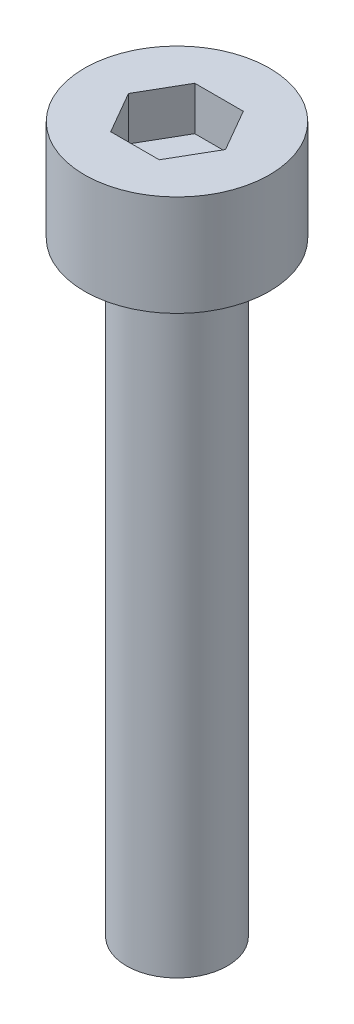
ISO-10303-21;
HEADER;
FILE_DESCRIPTION(('STEP AP214'),'2;1');
FILE_NAME('part.step','',(''),(''),'','','');
FILE_SCHEMA(('AUTOMOTIVE_DESIGN { 1 0 10303 214 1 1 1 1 }'));
ENDSEC;
DATA;
#1=APPLICATION_CONTEXT('core data for automotive mechanical design processes');
#2=APPLICATION_PROTOCOL_DEFINITION('international standard','automotive_design',2000,#1);
#3=PRODUCT_CONTEXT('',#1,'mechanical');
#4=PRODUCT('Part','Part','',(#3));
#5=PRODUCT_RELATED_PRODUCT_CATEGORY('part','',(#4));
#6=PRODUCT_DEFINITION_FORMATION('','',#4);
#7=PRODUCT_DEFINITION_CONTEXT('part definition',#1,'design');
#8=PRODUCT_DEFINITION('design','',#6,#7);
#9=PRODUCT_DEFINITION_SHAPE('','',#8);
#10=(LENGTH_UNIT() NAMED_UNIT(*) SI_UNIT(.MILLI.,.METRE.));
#11=(NAMED_UNIT(*) PLANE_ANGLE_UNIT() SI_UNIT($,.RADIAN.));
#12=(NAMED_UNIT(*) SI_UNIT($,.STERADIAN.) SOLID_ANGLE_UNIT());
#13=UNCERTAINTY_MEASURE_WITH_UNIT(LENGTH_MEASURE(1.E-05),#10,'distance_accuracy_value','');
#14=(GEOMETRIC_REPRESENTATION_CONTEXT(3) GLOBAL_UNCERTAINTY_ASSIGNED_CONTEXT((#13)) GLOBAL_UNIT_ASSIGNED_CONTEXT((#10,
#11,#12)) REPRESENTATION_CONTEXT('',''));
#15=CARTESIAN_POINT('',(0.,0.,0.));
#16=DIRECTION('',(0.,0.,1.));
#17=DIRECTION('',(1.,0.,0.));
#18=AXIS2_PLACEMENT_3D('',#15,#16,#17);
#19=CARTESIAN_POINT('',(0.,3.,0.));
#20=DIRECTION('',(0.,-1.,0.));
#21=DIRECTION('',(0.,0.,-1.));
#22=AXIS2_PLACEMENT_3D('',#19,#20,#21);
#23=CYLINDRICAL_SURFACE('',#22,2.75);
#24=CARTESIAN_POINT('',(0.,3.,0.));
#25=DIRECTION('',(0.,1.,0.));
#26=DIRECTION('',(0.,0.,1.));
#27=AXIS2_PLACEMENT_3D('',#24,#25,#26);
#28=CIRCLE('',#27,2.75);
#29=CARTESIAN_POINT('',(0.,3.,2.75));
#30=VERTEX_POINT('',#29);
#31=EDGE_CURVE('E11',#30,#30,#28,.T.);
#32=ORIENTED_EDGE('',*,*,#31,.F.);
#33=EDGE_LOOP('',(#32));
#34=FACE_BOUND('',#33,.T.);
#35=CARTESIAN_POINT('',(0.,0.,0.));
#36=DIRECTION('',(0.,1.,0.));
#37=DIRECTION('',(0.,0.,1.));
#38=AXIS2_PLACEMENT_3D('',#35,#36,#37);
#39=CIRCLE('',#38,2.75);
#40=CARTESIAN_POINT('',(0.,0.,2.75));
#41=VERTEX_POINT('',#40);
#42=EDGE_CURVE('E42',#41,#41,#39,.T.);
#43=ORIENTED_EDGE('',*,*,#42,.T.);
#44=EDGE_LOOP('',(#43));
#45=FACE_BOUND('',#44,.T.);
#46=ADVANCED_FACE('F39',(#34,#45),#23,.T.);
#47=CARTESIAN_POINT('',(0.,3.,0.));
#48=DIRECTION('',(0.,1.,0.));
#49=DIRECTION('',(0.,0.,1.));
#50=AXIS2_PLACEMENT_3D('',#47,#48,#49);
#51=PLANE('',#50);
#52=DIRECTION('',(0.5,0.,-0.866025403784439));
#53=VECTOR('',#52,1.);
#54=CARTESIAN_POINT('',(0.721687836487033,3.,1.25));
#55=LINE('',#54,#53);
#56=CARTESIAN_POINT('',(0.721687836487033,3.,1.25));
#57=VERTEX_POINT('',#56);
#58=CARTESIAN_POINT('',(1.44337567297406,3.,0.));
#59=VERTEX_POINT('',#58);
#60=EDGE_CURVE('E53',#57,#59,#55,.T.);
#61=ORIENTED_EDGE('',*,*,#60,.F.);
#62=DIRECTION('',(1.,0.,0.));
#63=VECTOR('',#62,1.);
#64=CARTESIAN_POINT('',(-0.721687836487031,3.,1.25));
#65=LINE('',#64,#63);
#66=CARTESIAN_POINT('',(-0.721687836487031,3.,1.25));
#67=VERTEX_POINT('',#66);
#68=EDGE_CURVE('E136',#67,#57,#65,.T.);
#69=ORIENTED_EDGE('',*,*,#68,.F.);
#70=DIRECTION('',(0.5,0.,0.866025403784438));
#71=VECTOR('',#70,1.);
#72=CARTESIAN_POINT('',(-1.44337567297406,3.,0.));
#73=LINE('',#72,#71);
#74=CARTESIAN_POINT('',(-1.44337567297406,3.,0.));
#75=VERTEX_POINT('',#74);
#76=EDGE_CURVE('E134',#75,#67,#73,.T.);
#77=ORIENTED_EDGE('',*,*,#76,.F.);
#78=DIRECTION('',(-0.5,0.,0.866025403784439));
#79=VECTOR('',#78,1.);
#80=CARTESIAN_POINT('',(-0.721687836487032,3.,-1.25));
#81=LINE('',#80,#79);
#82=CARTESIAN_POINT('',(-0.721687836487032,3.,-1.25));
#83=VERTEX_POINT('',#82);
#84=EDGE_CURVE('E101',#83,#75,#81,.T.);
#85=ORIENTED_EDGE('',*,*,#84,.F.);
#86=DIRECTION('',(-1.,0.,0.));
#87=VECTOR('',#86,1.);
#88=CARTESIAN_POINT('',(0.721687836487032,3.,-1.25));
#89=LINE('',#88,#87);
#90=CARTESIAN_POINT('',(0.721687836487032,3.,-1.25));
#91=VERTEX_POINT('',#90);
#92=EDGE_CURVE('E130',#91,#83,#89,.T.);
#93=ORIENTED_EDGE('',*,*,#92,.F.);
#94=DIRECTION('',(-0.5,0.,-0.866025403784439));
#95=VECTOR('',#94,1.);
#96=CARTESIAN_POINT('',(1.44337567297406,3.,0.));
#97=LINE('',#96,#95);
#98=EDGE_CURVE('E127',#59,#91,#97,.T.);
#99=ORIENTED_EDGE('',*,*,#98,.F.);
#100=EDGE_LOOP('',(#61,#69,#77,#85,#93,#99));
#101=FACE_BOUND('',#100,.T.);
#102=ORIENTED_EDGE('',*,*,#31,.T.);
#103=EDGE_LOOP('',(#102));
#104=FACE_BOUND('',#103,.T.);
#105=ADVANCED_FACE('F167',(#101,#104),#51,.T.);
#106=CARTESIAN_POINT('',(0.,0.,0.));
#107=DIRECTION('',(0.,1.,0.));
#108=DIRECTION('',(0.,0.,1.));
#109=AXIS2_PLACEMENT_3D('',#106,#107,#108);
#110=PLANE('',#109);
#111=CARTESIAN_POINT('',(0.,0.,0.));
#112=DIRECTION('',(0.,1.,0.));
#113=DIRECTION('',(0.,0.,1.));
#114=AXIS2_PLACEMENT_3D('',#111,#112,#113);
#115=CIRCLE('',#114,1.5);
#116=CARTESIAN_POINT('',(0.,0.,1.5));
#117=VERTEX_POINT('',#116);
#118=EDGE_CURVE('E140',#117,#117,#115,.T.);
#119=ORIENTED_EDGE('',*,*,#118,.T.);
#120=EDGE_LOOP('',(#119));
#121=FACE_BOUND('',#120,.T.);
#122=ORIENTED_EDGE('',*,*,#42,.F.);
#123=EDGE_LOOP('',(#122));
#124=FACE_BOUND('',#123,.T.);
#125=ADVANCED_FACE('F152',(#121,#124),#110,.F.);
#126=CARTESIAN_POINT('',(0.,-18.,0.));
#127=DIRECTION('',(0.,1.,0.));
#128=DIRECTION('',(0.,0.,1.));
#129=AXIS2_PLACEMENT_3D('',#126,#127,#128);
#130=CYLINDRICAL_SURFACE('',#129,1.5);
#131=CARTESIAN_POINT('',(0.,-18.,0.));
#132=DIRECTION('',(0.,1.,0.));
#133=DIRECTION('',(0.,0.,1.));
#134=AXIS2_PLACEMENT_3D('',#131,#132,#133);
#135=CIRCLE('',#134,1.5);
#136=CARTESIAN_POINT('',(0.,-18.,1.5));
#137=VERTEX_POINT('',#136);
#138=EDGE_CURVE('E146',#137,#137,#135,.T.);
#139=ORIENTED_EDGE('',*,*,#138,.T.);
#140=EDGE_LOOP('',(#139));
#141=FACE_BOUND('',#140,.T.);
#142=ORIENTED_EDGE('',*,*,#118,.F.);
#143=EDGE_LOOP('',(#142));
#144=FACE_BOUND('',#143,.T.);
#145=ADVANCED_FACE('F155',(#141,#144),#130,.T.);
#146=CARTESIAN_POINT('',(0.,-18.,0.));
#147=DIRECTION('',(0.,1.,0.));
#148=DIRECTION('',(0.,0.,1.));
#149=AXIS2_PLACEMENT_3D('',#146,#147,#148);
#150=PLANE('',#149);
#151=ORIENTED_EDGE('',*,*,#138,.F.);
#152=EDGE_LOOP('',(#151));
#153=FACE_BOUND('',#152,.T.);
#154=ADVANCED_FACE('F157',(#153),#150,.F.);
#155=CARTESIAN_POINT('',(0.721687836487033,1.7,1.25));
#156=DIRECTION('',(0.866025403784439,0.,0.5));
#157=DIRECTION('',(0.5,0.,-0.866025403784439));
#158=AXIS2_PLACEMENT_3D('',#155,#156,#157);
#159=PLANE('',#158);
#160=ORIENTED_EDGE('',*,*,#60,.T.);
#161=DIRECTION('',(0.,1.,0.));
#162=VECTOR('',#161,1.);
#163=CARTESIAN_POINT('',(1.44337567297406,1.7,0.));
#164=LINE('',#163,#162);
#165=CARTESIAN_POINT('',(1.44337567297406,1.7,0.));
#166=VERTEX_POINT('',#165);
#167=EDGE_CURVE('E83',#166,#59,#164,.T.);
#168=ORIENTED_EDGE('',*,*,#167,.F.);
#169=DIRECTION('',(0.5,0.,-0.866025403784439));
#170=VECTOR('',#169,1.);
#171=CARTESIAN_POINT('',(0.721687836487033,1.7,1.25));
#172=LINE('',#171,#170);
#173=CARTESIAN_POINT('',(0.721687836487033,1.7,1.25));
#174=VERTEX_POINT('',#173);
#175=EDGE_CURVE('E138',#174,#166,#172,.T.);
#176=ORIENTED_EDGE('',*,*,#175,.F.);
#177=DIRECTION('',(0.,1.,0.));
#178=VECTOR('',#177,1.);
#179=CARTESIAN_POINT('',(0.721687836487033,1.7,1.25));
#180=LINE('',#179,#178);
#181=EDGE_CURVE('E61',#174,#57,#180,.T.);
#182=ORIENTED_EDGE('',*,*,#181,.T.);
#183=EDGE_LOOP('',(#160,#168,#176,#182));
#184=FACE_BOUND('',#183,.T.);
#185=ADVANCED_FACE('F164',(#184),#159,.F.);
#186=CARTESIAN_POINT('',(-0.721687836487031,1.7,1.25));
#187=DIRECTION('',(0.,0.,1.));
#188=DIRECTION('',(1.,0.,0.));
#189=AXIS2_PLACEMENT_3D('',#186,#187,#188);
#190=PLANE('',#189);
#191=ORIENTED_EDGE('',*,*,#68,.T.);
#192=ORIENTED_EDGE('',*,*,#181,.F.);
#193=DIRECTION('',(1.,0.,0.));
#194=VECTOR('',#193,1.);
#195=CARTESIAN_POINT('',(-0.721687836487031,1.7,1.25));
#196=LINE('',#195,#194);
#197=CARTESIAN_POINT('',(-0.721687836487031,1.7,1.25));
#198=VERTEX_POINT('',#197);
#199=EDGE_CURVE('E113',#198,#174,#196,.T.);
#200=ORIENTED_EDGE('',*,*,#199,.F.);
#201=DIRECTION('',(0.,1.,0.));
#202=VECTOR('',#201,1.);
#203=CARTESIAN_POINT('',(-0.721687836487031,1.7,1.25));
#204=LINE('',#203,#202);
#205=EDGE_CURVE('E105',#198,#67,#204,.T.);
#206=ORIENTED_EDGE('',*,*,#205,.T.);
#207=EDGE_LOOP('',(#191,#192,#200,#206));
#208=FACE_BOUND('',#207,.T.);
#209=ADVANCED_FACE('F189',(#208),#190,.F.);
#210=CARTESIAN_POINT('',(-1.44337567297406,1.7,0.));
#211=DIRECTION('',(-0.866025403784438,0.,0.5));
#212=DIRECTION('',(0.5,0.,0.866025403784438));
#213=AXIS2_PLACEMENT_3D('',#210,#211,#212);
#214=PLANE('',#213);
#215=ORIENTED_EDGE('',*,*,#76,.T.);
#216=ORIENTED_EDGE('',*,*,#205,.F.);
#217=DIRECTION('',(0.5,0.,0.866025403784438));
#218=VECTOR('',#217,1.);
#219=CARTESIAN_POINT('',(-1.44337567297406,1.7,0.));
#220=LINE('',#219,#218);
#221=CARTESIAN_POINT('',(-1.44337567297406,1.7,0.));
#222=VERTEX_POINT('',#221);
#223=EDGE_CURVE('E109',#222,#198,#220,.T.);
#224=ORIENTED_EDGE('',*,*,#223,.F.);
#225=DIRECTION('',(0.,1.,0.));
#226=VECTOR('',#225,1.);
#227=CARTESIAN_POINT('',(-1.44337567297406,1.7,0.));
#228=LINE('',#227,#226);
#229=EDGE_CURVE('E94',#222,#75,#228,.T.);
#230=ORIENTED_EDGE('',*,*,#229,.T.);
#231=EDGE_LOOP('',(#215,#216,#224,#230));
#232=FACE_BOUND('',#231,.T.);
#233=ADVANCED_FACE('F110',(#232),#214,.F.);
#234=CARTESIAN_POINT('',(-0.721687836487032,1.7,-1.25));
#235=DIRECTION('',(-0.866025403784439,0.,-0.5));
#236=DIRECTION('',(-0.5,0.,0.866025403784439));
#237=AXIS2_PLACEMENT_3D('',#234,#235,#236);
#238=PLANE('',#237);
#239=ORIENTED_EDGE('',*,*,#84,.T.);
#240=ORIENTED_EDGE('',*,*,#229,.F.);
#241=DIRECTION('',(-0.5,0.,0.866025403784439));
#242=VECTOR('',#241,1.);
#243=CARTESIAN_POINT('',(-0.721687836487032,1.7,-1.25));
#244=LINE('',#243,#242);
#245=CARTESIAN_POINT('',(-0.721687836487032,1.7,-1.25));
#246=VERTEX_POINT('',#245);
#247=EDGE_CURVE('E98',#246,#222,#244,.T.);
#248=ORIENTED_EDGE('',*,*,#247,.F.);
#249=DIRECTION('',(0.,1.,0.));
#250=VECTOR('',#249,1.);
#251=CARTESIAN_POINT('',(-0.721687836487032,1.7,-1.25));
#252=LINE('',#251,#250);
#253=EDGE_CURVE('E106',#246,#83,#252,.T.);
#254=ORIENTED_EDGE('',*,*,#253,.T.);
#255=EDGE_LOOP('',(#239,#240,#248,#254));
#256=FACE_BOUND('',#255,.T.);
#257=ADVANCED_FACE('F96',(#256),#238,.F.);
#258=CARTESIAN_POINT('',(0.721687836487032,1.7,-1.25));
#259=DIRECTION('',(0.,0.,-1.));
#260=DIRECTION('',(-1.,0.,0.));
#261=AXIS2_PLACEMENT_3D('',#258,#259,#260);
#262=PLANE('',#261);
#263=ORIENTED_EDGE('',*,*,#92,.T.);
#264=ORIENTED_EDGE('',*,*,#253,.F.);
#265=DIRECTION('',(-1.,0.,0.));
#266=VECTOR('',#265,1.);
#267=CARTESIAN_POINT('',(0.721687836487032,1.7,-1.25));
#268=LINE('',#267,#266);
#269=CARTESIAN_POINT('',(0.721687836487032,1.7,-1.25));
#270=VERTEX_POINT('',#269);
#271=EDGE_CURVE('E119',#270,#246,#268,.T.);
#272=ORIENTED_EDGE('',*,*,#271,.F.);
#273=DIRECTION('',(0.,1.,0.));
#274=VECTOR('',#273,1.);
#275=CARTESIAN_POINT('',(0.721687836487032,1.7,-1.25));
#276=LINE('',#275,#274);
#277=EDGE_CURVE('E143',#270,#91,#276,.T.);
#278=ORIENTED_EDGE('',*,*,#277,.T.);
#279=EDGE_LOOP('',(#263,#264,#272,#278));
#280=FACE_BOUND('',#279,.T.);
#281=ADVANCED_FACE('F198',(#280),#262,.F.);
#282=CARTESIAN_POINT('',(1.44337567297406,1.7,0.));
#283=DIRECTION('',(0.866025403784439,0.,-0.5));
#284=DIRECTION('',(-0.5,0.,-0.866025403784439));
#285=AXIS2_PLACEMENT_3D('',#282,#283,#284);
#286=PLANE('',#285);
#287=ORIENTED_EDGE('',*,*,#98,.T.);
#288=ORIENTED_EDGE('',*,*,#277,.F.);
#289=DIRECTION('',(-0.5,0.,-0.866025403784439));
#290=VECTOR('',#289,1.);
#291=CARTESIAN_POINT('',(1.44337567297406,1.7,0.));
#292=LINE('',#291,#290);
#293=EDGE_CURVE('E121',#166,#270,#292,.T.);
#294=ORIENTED_EDGE('',*,*,#293,.F.);
#295=ORIENTED_EDGE('',*,*,#167,.T.);
#296=EDGE_LOOP('',(#287,#288,#294,#295));
#297=FACE_BOUND('',#296,.T.);
#298=ADVANCED_FACE('F186',(#297),#286,.F.);
#299=CARTESIAN_POINT('',(0.,1.7,0.));
#300=DIRECTION('',(0.,1.,0.));
#301=DIRECTION('',(0.,0.,1.));
#302=AXIS2_PLACEMENT_3D('',#299,#300,#301);
#303=PLANE('',#302);
#304=ORIENTED_EDGE('',*,*,#175,.T.);
#305=ORIENTED_EDGE('',*,*,#293,.T.);
#306=ORIENTED_EDGE('',*,*,#271,.T.);
#307=ORIENTED_EDGE('',*,*,#247,.T.);
#308=ORIENTED_EDGE('',*,*,#223,.T.);
#309=ORIENTED_EDGE('',*,*,#199,.T.);
#310=EDGE_LOOP('',(#304,#305,#306,#307,#308,#309));
#311=FACE_BOUND('',#310,.T.);
#312=ADVANCED_FACE('F116',(#311),#303,.T.);
#313=CLOSED_SHELL('',(#46,#105,#125,#145,#154,#185,#209,#233,#257,#281,#298,#312));
#314=MANIFOLD_SOLID_BREP('B2',#313);
#315=ADVANCED_BREP_SHAPE_REPRESENTATION('',(#18,#314),#14);
#316=SHAPE_DEFINITION_REPRESENTATION(#9,#315);
ENDSEC;
END-ISO-10303-21;
